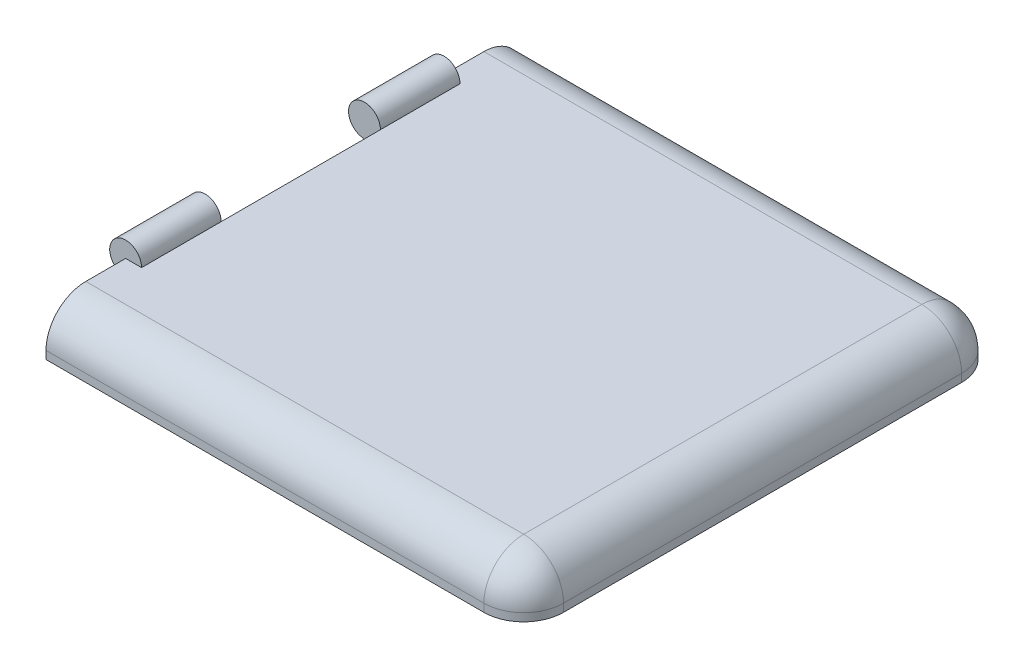
ISO-10303-21;
HEADER;
FILE_DESCRIPTION(('STEP AP214'),'2;1');
FILE_NAME('part.step','',(''),(''),'','','');
FILE_SCHEMA(('AUTOMOTIVE_DESIGN { 1 0 10303 214 1 1 1 1 }'));
ENDSEC;
DATA;
#1=APPLICATION_CONTEXT('core data for automotive mechanical design processes');
#2=APPLICATION_PROTOCOL_DEFINITION('international standard','automotive_design',2000,#1);
#3=PRODUCT_CONTEXT('',#1,'mechanical');
#4=PRODUCT('Part','Part','',(#3));
#5=PRODUCT_RELATED_PRODUCT_CATEGORY('part','',(#4));
#6=PRODUCT_DEFINITION_FORMATION('','',#4);
#7=PRODUCT_DEFINITION_CONTEXT('part definition',#1,'design');
#8=PRODUCT_DEFINITION('design','',#6,#7);
#9=PRODUCT_DEFINITION_SHAPE('','',#8);
#10=(LENGTH_UNIT() NAMED_UNIT(*) SI_UNIT(.MILLI.,.METRE.));
#11=(NAMED_UNIT(*) PLANE_ANGLE_UNIT() SI_UNIT($,.RADIAN.));
#12=(NAMED_UNIT(*) SI_UNIT($,.STERADIAN.) SOLID_ANGLE_UNIT());
#13=UNCERTAINTY_MEASURE_WITH_UNIT(LENGTH_MEASURE(1.E-05),#10,'distance_accuracy_value','');
#14=(GEOMETRIC_REPRESENTATION_CONTEXT(3) GLOBAL_UNCERTAINTY_ASSIGNED_CONTEXT((#13)) GLOBAL_UNIT_ASSIGNED_CONTEXT((#10,
#11,#12)) REPRESENTATION_CONTEXT('',''));
#15=CARTESIAN_POINT('',(0.,0.,0.));
#16=DIRECTION('',(0.,0.,1.));
#17=DIRECTION('',(1.,0.,0.));
#18=AXIS2_PLACEMENT_3D('',#15,#16,#17);
#19=CARTESIAN_POINT('',(0.,60.,0.));
#20=DIRECTION('',(1.,0.,0.));
#21=DIRECTION('',(0.,0.,-1.));
#22=AXIS2_PLACEMENT_3D('',#19,#20,#21);
#23=PLANE('',#22);
#24=DIRECTION('',(0.,-1.,0.));
#25=VECTOR('',#24,1.);
#26=CARTESIAN_POINT('',(0.,60.,0.));
#27=LINE('',#26,#25);
#28=CARTESIAN_POINT('',(0.,9.99999999999999,0.));
#29=VERTEX_POINT('',#28);
#30=CARTESIAN_POINT('',(0.,0.,0.));
#31=VERTEX_POINT('',#30);
#32=EDGE_CURVE('E290',#29,#31,#27,.T.);
#33=ORIENTED_EDGE('',*,*,#32,.F.);
#34=CARTESIAN_POINT('',(0.,9.99999999999999,-50.));
#35=DIRECTION('',(1.,0.,0.));
#36=DIRECTION('',(0.,0.,-1.));
#37=AXIS2_PLACEMENT_3D('',#34,#35,#36);
#38=CIRCLE('',#37,50.);
#39=CARTESIAN_POINT('',(0.,60.,-50.));
#40=VERTEX_POINT('',#39);
#41=EDGE_CURVE('E199',#29,#40,#38,.F.);
#42=ORIENTED_EDGE('',*,*,#41,.T.);
#43=DIRECTION('',(0.,0.,1.));
#44=VECTOR('',#43,1.);
#45=CARTESIAN_POINT('',(0.,60.,0.));
#46=LINE('',#45,#44);
#47=CARTESIAN_POINT('',(0.,60.,-100.));
#48=VERTEX_POINT('',#47);
#49=EDGE_CURVE('E272',#48,#40,#46,.T.);
#50=ORIENTED_EDGE('',*,*,#49,.F.);
#51=DIRECTION('',(0.,-1.,0.));
#52=VECTOR('',#51,1.);
#53=CARTESIAN_POINT('',(0.,60.,-100.));
#54=LINE('',#53,#52);
#55=CARTESIAN_POINT('',(0.,40.,-100.));
#56=VERTEX_POINT('',#55);
#57=EDGE_CURVE('E257',#48,#56,#54,.T.);
#58=ORIENTED_EDGE('',*,*,#57,.T.);
#59=DIRECTION('',(0.,0.,-1.));
#60=VECTOR('',#59,1.);
#61=CARTESIAN_POINT('',(0.,40.,-100.));
#62=LINE('',#61,#60);
#63=CARTESIAN_POINT('',(0.,40.,-200.));
#64=VERTEX_POINT('',#63);
#65=EDGE_CURVE('E263',#64,#56,#62,.F.);
#66=ORIENTED_EDGE('',*,*,#65,.F.);
#67=DIRECTION('',(0.,0.,1.));
#68=VECTOR('',#67,1.);
#69=CARTESIAN_POINT('',(0.,40.,-456.568542494924));
#70=LINE('',#69,#68);
#71=CARTESIAN_POINT('',(0.,40.,-400.));
#72=VERTEX_POINT('',#71);
#73=EDGE_CURVE('E145',#64,#72,#70,.F.);
#74=ORIENTED_EDGE('',*,*,#73,.T.);
#75=DIRECTION('',(0.,0.,1.));
#76=VECTOR('',#75,1.);
#77=CARTESIAN_POINT('',(0.,40.,-500.));
#78=LINE('',#77,#76);
#79=CARTESIAN_POINT('',(0.,40.,-500.));
#80=VERTEX_POINT('',#79);
#81=EDGE_CURVE('E161',#72,#80,#78,.F.);
#82=ORIENTED_EDGE('',*,*,#81,.T.);
#83=DIRECTION('',(0.,-1.,0.));
#84=VECTOR('',#83,1.);
#85=CARTESIAN_POINT('',(0.,60.,-500.));
#86=LINE('',#85,#84);
#87=CARTESIAN_POINT('',(0.,60.,-500.));
#88=VERTEX_POINT('',#87);
#89=EDGE_CURVE('E246',#88,#80,#86,.T.);
#90=ORIENTED_EDGE('',*,*,#89,.F.);
#91=CARTESIAN_POINT('',(0.,60.,-550.));
#92=VERTEX_POINT('',#91);
#93=EDGE_CURVE('E268',#92,#88,#46,.T.);
#94=ORIENTED_EDGE('',*,*,#93,.F.);
#95=CARTESIAN_POINT('',(0.,9.99999999999999,-550.));
#96=DIRECTION('',(1.,0.,0.));
#97=DIRECTION('',(0.,0.,-1.));
#98=AXIS2_PLACEMENT_3D('',#95,#96,#97);
#99=CIRCLE('',#98,50.);
#100=CARTESIAN_POINT('',(0.,9.99999999999999,-600.));
#101=VERTEX_POINT('',#100);
#102=EDGE_CURVE('E196',#92,#101,#99,.F.);
#103=ORIENTED_EDGE('',*,*,#102,.T.);
#104=DIRECTION('',(0.,-1.,0.));
#105=VECTOR('',#104,1.);
#106=CARTESIAN_POINT('',(0.,60.,-600.));
#107=LINE('',#106,#105);
#108=CARTESIAN_POINT('',(0.,0.,-600.));
#109=VERTEX_POINT('',#108);
#110=EDGE_CURVE('E271',#101,#109,#107,.T.);
#111=ORIENTED_EDGE('',*,*,#110,.T.);
#112=DIRECTION('',(0.,0.,1.));
#113=VECTOR('',#112,1.);
#114=CARTESIAN_POINT('',(0.,0.,0.));
#115=LINE('',#114,#113);
#116=EDGE_CURVE('E267',#109,#31,#115,.T.);
#117=ORIENTED_EDGE('',*,*,#116,.T.);
#118=EDGE_LOOP('',(#33,#42,#50,#58,#66,#74,#82,#90,#94,#103,#111,#117));
#119=FACE_BOUND('',#118,.T.);
#120=ADVANCED_FACE('F39',(#119),#23,.F.);
#121=CARTESIAN_POINT('',(0.,60.,0.));
#122=DIRECTION('',(0.,-1.,0.));
#123=DIRECTION('',(0.,0.,-1.));
#124=AXIS2_PLACEMENT_3D('',#121,#122,#123);
#125=PLANE('',#124);
#126=ORIENTED_EDGE('',*,*,#49,.T.);
#127=DIRECTION('',(1.,0.,0.));
#128=VECTOR('',#127,1.);
#129=CARTESIAN_POINT('',(0.,60.,-50.));
#130=LINE('',#129,#128);
#131=CARTESIAN_POINT('',(550.,60.,-50.));
#132=VERTEX_POINT('',#131);
#133=EDGE_CURVE('E186',#40,#132,#130,.T.);
#134=ORIENTED_EDGE('',*,*,#133,.T.);
#135=DIRECTION('',(0.,0.,-1.));
#136=VECTOR('',#135,1.);
#137=CARTESIAN_POINT('',(550.,60.,0.));
#138=LINE('',#137,#136);
#139=CARTESIAN_POINT('',(550.,60.,-550.));
#140=VERTEX_POINT('',#139);
#141=EDGE_CURVE('E183',#132,#140,#138,.T.);
#142=ORIENTED_EDGE('',*,*,#141,.T.);
#143=DIRECTION('',(-1.,0.,0.));
#144=VECTOR('',#143,1.);
#145=CARTESIAN_POINT('',(0.,60.,-550.));
#146=LINE('',#145,#144);
#147=EDGE_CURVE('E175',#140,#92,#146,.T.);
#148=ORIENTED_EDGE('',*,*,#147,.T.);
#149=ORIENTED_EDGE('',*,*,#93,.T.);
#150=DIRECTION('',(-1.,0.,0.));
#151=VECTOR('',#150,1.);
#152=CARTESIAN_POINT('',(0.,60.,-500.));
#153=LINE('',#152,#151);
#154=CARTESIAN_POINT('',(20.,60.,-500.));
#155=VERTEX_POINT('',#154);
#156=EDGE_CURVE('E169',#155,#88,#153,.T.);
#157=ORIENTED_EDGE('',*,*,#156,.F.);
#158=DIRECTION('',(0.,0.,1.));
#159=VECTOR('',#158,1.);
#160=CARTESIAN_POINT('',(20.,60.,-500.));
#161=LINE('',#160,#159);
#162=CARTESIAN_POINT('',(20.,60.,-400.));
#163=VERTEX_POINT('',#162);
#164=EDGE_CURVE('E158',#155,#163,#161,.T.);
#165=ORIENTED_EDGE('',*,*,#164,.T.);
#166=DIRECTION('',(0.,0.,1.));
#167=VECTOR('',#166,1.);
#168=CARTESIAN_POINT('',(20.,60.,-456.568542494924));
#169=LINE('',#168,#167);
#170=CARTESIAN_POINT('',(20.,60.,-200.));
#171=VERTEX_POINT('',#170);
#172=EDGE_CURVE('E134',#163,#171,#169,.T.);
#173=ORIENTED_EDGE('',*,*,#172,.T.);
#174=DIRECTION('',(0.,0.,-1.));
#175=VECTOR('',#174,1.);
#176=CARTESIAN_POINT('',(20.,60.,-100.));
#177=LINE('',#176,#175);
#178=CARTESIAN_POINT('',(20.,60.,-100.));
#179=VERTEX_POINT('',#178);
#180=EDGE_CURVE('E177',#179,#171,#177,.T.);
#181=ORIENTED_EDGE('',*,*,#180,.F.);
#182=DIRECTION('',(-1.,0.,0.));
#183=VECTOR('',#182,1.);
#184=CARTESIAN_POINT('',(0.,60.,-100.));
#185=LINE('',#184,#183);
#186=EDGE_CURVE('E171',#179,#48,#185,.T.);
#187=ORIENTED_EDGE('',*,*,#186,.T.);
#188=EDGE_LOOP('',(#126,#134,#142,#148,#149,#157,#165,#173,#181,#187));
#189=FACE_BOUND('',#188,.T.);
#190=ADVANCED_FACE('F167',(#189),#125,.F.);
#191=CARTESIAN_POINT('',(0.,60.,0.));
#192=DIRECTION('',(0.,0.,-1.));
#193=DIRECTION('',(-1.,0.,0.));
#194=AXIS2_PLACEMENT_3D('',#191,#192,#193);
#195=PLANE('',#194);
#196=DIRECTION('',(0.,-1.,0.));
#197=VECTOR('',#196,1.);
#198=CARTESIAN_POINT('',(550.,60.,0.));
#199=LINE('',#198,#197);
#200=CARTESIAN_POINT('',(550.,0.,0.));
#201=VERTEX_POINT('',#200);
#202=CARTESIAN_POINT('',(550.,9.99999999999999,0.));
#203=VERTEX_POINT('',#202);
#204=EDGE_CURVE('E190',#201,#203,#199,.F.);
#205=ORIENTED_EDGE('',*,*,#204,.T.);
#206=DIRECTION('',(1.,0.,0.));
#207=VECTOR('',#206,1.);
#208=CARTESIAN_POINT('',(0.,9.99999999999999,0.));
#209=LINE('',#208,#207);
#210=EDGE_CURVE('E193',#203,#29,#209,.F.);
#211=ORIENTED_EDGE('',*,*,#210,.T.);
#212=ORIENTED_EDGE('',*,*,#32,.T.);
#213=DIRECTION('',(1.,0.,0.));
#214=VECTOR('',#213,1.);
#215=CARTESIAN_POINT('',(0.,0.,0.));
#216=LINE('',#215,#214);
#217=EDGE_CURVE('E276',#31,#201,#216,.T.);
#218=ORIENTED_EDGE('',*,*,#217,.T.);
#219=EDGE_LOOP('',(#205,#211,#212,#218));
#220=FACE_BOUND('',#219,.T.);
#221=ADVANCED_FACE('F342',(#220),#195,.F.);
#222=CARTESIAN_POINT('',(600.,60.,0.));
#223=DIRECTION('',(-1.,0.,0.));
#224=DIRECTION('',(0.,0.,1.));
#225=AXIS2_PLACEMENT_3D('',#222,#223,#224);
#226=PLANE('',#225);
#227=DIRECTION('',(0.,0.,-1.));
#228=VECTOR('',#227,1.);
#229=CARTESIAN_POINT('',(600.,0.,0.));
#230=LINE('',#229,#228);
#231=CARTESIAN_POINT('',(600.,0.,-50.));
#232=VERTEX_POINT('',#231);
#233=CARTESIAN_POINT('',(600.,0.,-550.));
#234=VERTEX_POINT('',#233);
#235=EDGE_CURVE('E280',#232,#234,#230,.T.);
#236=ORIENTED_EDGE('',*,*,#235,.T.);
#237=DIRECTION('',(0.,-1.,0.));
#238=VECTOR('',#237,1.);
#239=CARTESIAN_POINT('',(600.,60.,-550.));
#240=LINE('',#239,#238);
#241=CARTESIAN_POINT('',(600.,9.99999999999999,-550.));
#242=VERTEX_POINT('',#241);
#243=EDGE_CURVE('E208',#234,#242,#240,.F.);
#244=ORIENTED_EDGE('',*,*,#243,.T.);
#245=DIRECTION('',(0.,0.,-1.));
#246=VECTOR('',#245,1.);
#247=CARTESIAN_POINT('',(600.,9.99999999999999,0.));
#248=LINE('',#247,#246);
#249=CARTESIAN_POINT('',(600.,9.99999999999999,-50.));
#250=VERTEX_POINT('',#249);
#251=EDGE_CURVE('E205',#242,#250,#248,.F.);
#252=ORIENTED_EDGE('',*,*,#251,.T.);
#253=DIRECTION('',(0.,-1.,0.));
#254=VECTOR('',#253,1.);
#255=CARTESIAN_POINT('',(600.,60.,-50.));
#256=LINE('',#255,#254);
#257=EDGE_CURVE('E202',#250,#232,#256,.T.);
#258=ORIENTED_EDGE('',*,*,#257,.T.);
#259=EDGE_LOOP('',(#236,#244,#252,#258));
#260=FACE_BOUND('',#259,.T.);
#261=ADVANCED_FACE('F333',(#260),#226,.F.);
#262=CARTESIAN_POINT('',(0.,60.,-600.));
#263=DIRECTION('',(0.,0.,1.));
#264=DIRECTION('',(1.,0.,0.));
#265=AXIS2_PLACEMENT_3D('',#262,#263,#264);
#266=PLANE('',#265);
#267=ORIENTED_EDGE('',*,*,#110,.F.);
#268=DIRECTION('',(-1.,0.,0.));
#269=VECTOR('',#268,1.);
#270=CARTESIAN_POINT('',(0.,9.99999999999999,-600.));
#271=LINE('',#270,#269);
#272=CARTESIAN_POINT('',(550.,9.99999999999999,-600.));
#273=VERTEX_POINT('',#272);
#274=EDGE_CURVE('E57',#101,#273,#271,.F.);
#275=ORIENTED_EDGE('',*,*,#274,.T.);
#276=DIRECTION('',(0.,-1.,0.));
#277=VECTOR('',#276,1.);
#278=CARTESIAN_POINT('',(550.,60.,-600.));
#279=LINE('',#278,#277);
#280=CARTESIAN_POINT('',(550.,0.,-600.));
#281=VERTEX_POINT('',#280);
#282=EDGE_CURVE('E61',#273,#281,#279,.T.);
#283=ORIENTED_EDGE('',*,*,#282,.T.);
#284=DIRECTION('',(-1.,0.,0.));
#285=VECTOR('',#284,1.);
#286=CARTESIAN_POINT('',(0.,0.,-600.));
#287=LINE('',#286,#285);
#288=EDGE_CURVE('E284',#281,#109,#287,.T.);
#289=ORIENTED_EDGE('',*,*,#288,.T.);
#290=EDGE_LOOP('',(#267,#275,#283,#289));
#291=FACE_BOUND('',#290,.T.);
#292=ADVANCED_FACE('F323',(#291),#266,.F.);
#293=CARTESIAN_POINT('',(0.,0.,0.));
#294=DIRECTION('',(0.,-1.,0.));
#295=DIRECTION('',(0.,0.,-1.));
#296=AXIS2_PLACEMENT_3D('',#293,#294,#295);
#297=PLANE('',#296);
#298=ORIENTED_EDGE('',*,*,#288,.F.);
#299=CARTESIAN_POINT('',(550.,0.,-550.));
#300=DIRECTION('',(0.,-1.,0.));
#301=DIRECTION('',(0.,0.,-1.));
#302=AXIS2_PLACEMENT_3D('',#299,#300,#301);
#303=CIRCLE('',#302,50.);
#304=EDGE_CURVE('E11',#281,#234,#303,.T.);
#305=ORIENTED_EDGE('',*,*,#304,.T.);
#306=ORIENTED_EDGE('',*,*,#235,.F.);
#307=CARTESIAN_POINT('',(550.,0.,-50.));
#308=DIRECTION('',(0.,-1.,0.));
#309=DIRECTION('',(0.,0.,-1.));
#310=AXIS2_PLACEMENT_3D('',#307,#308,#309);
#311=CIRCLE('',#310,50.);
#312=EDGE_CURVE('E49',#232,#201,#311,.T.);
#313=ORIENTED_EDGE('',*,*,#312,.T.);
#314=ORIENTED_EDGE('',*,*,#217,.F.);
#315=ORIENTED_EDGE('',*,*,#116,.F.);
#316=EDGE_LOOP('',(#298,#305,#306,#313,#314,#315));
#317=FACE_BOUND('',#316,.T.);
#318=ADVANCED_FACE('F326',(#317),#297,.T.);
#319=CARTESIAN_POINT('',(0.,60.,-100.));
#320=DIRECTION('',(0.,0.,-1.));
#321=DIRECTION('',(-1.,0.,0.));
#322=AXIS2_PLACEMENT_3D('',#319,#320,#321);
#323=CYLINDRICAL_SURFACE('',#322,20.);
#324=CARTESIAN_POINT('',(0.,60.,-200.));
#325=DIRECTION('',(0.,0.,1.));
#326=DIRECTION('',(1.,0.,0.));
#327=AXIS2_PLACEMENT_3D('',#324,#325,#326);
#328=CIRCLE('',#327,20.);
#329=EDGE_CURVE('E252',#171,#64,#328,.T.);
#330=ORIENTED_EDGE('',*,*,#329,.T.);
#331=ORIENTED_EDGE('',*,*,#65,.T.);
#332=CARTESIAN_POINT('',(0.,60.,-100.));
#333=DIRECTION('',(0.,0.,1.));
#334=DIRECTION('',(1.,0.,0.));
#335=AXIS2_PLACEMENT_3D('',#332,#333,#334);
#336=CIRCLE('',#335,20.);
#337=EDGE_CURVE('E253',#179,#56,#336,.T.);
#338=ORIENTED_EDGE('',*,*,#337,.F.);
#339=ORIENTED_EDGE('',*,*,#180,.T.);
#340=EDGE_LOOP('',(#330,#331,#338,#339));
#341=FACE_BOUND('',#340,.T.);
#342=ADVANCED_FACE('F296',(#341),#323,.T.);
#343=CARTESIAN_POINT('',(0.,60.,-100.));
#344=DIRECTION('',(0.,0.,1.));
#345=DIRECTION('',(1.,0.,0.));
#346=AXIS2_PLACEMENT_3D('',#343,#344,#345);
#347=PLANE('',#346);
#348=ORIENTED_EDGE('',*,*,#57,.F.);
#349=ORIENTED_EDGE('',*,*,#186,.F.);
#350=ORIENTED_EDGE('',*,*,#337,.T.);
#351=EDGE_LOOP('',(#348,#349,#350));
#352=FACE_BOUND('',#351,.T.);
#353=ADVANCED_FACE('F306',(#352),#347,.T.);
#354=CARTESIAN_POINT('',(0.,60.,-200.));
#355=DIRECTION('',(0.,0.,1.));
#356=DIRECTION('',(1.,0.,0.));
#357=AXIS2_PLACEMENT_3D('',#354,#355,#356);
#358=PLANE('',#357);
#359=CARTESIAN_POINT('',(0.,60.,-200.));
#360=DIRECTION('',(0.,0.,1.));
#361=DIRECTION('',(1.,0.,0.));
#362=AXIS2_PLACEMENT_3D('',#359,#360,#361);
#363=CIRCLE('',#362,20.);
#364=EDGE_CURVE('E140',#64,#171,#363,.T.);
#365=ORIENTED_EDGE('',*,*,#364,.F.);
#366=ORIENTED_EDGE('',*,*,#329,.F.);
#367=EDGE_LOOP('',(#365,#366));
#368=FACE_BOUND('',#367,.T.);
#369=ADVANCED_FACE('F299',(#368),#358,.F.);
#370=CARTESIAN_POINT('',(0.,60.,-500.));
#371=DIRECTION('',(0.,0.,1.));
#372=DIRECTION('',(1.,0.,0.));
#373=AXIS2_PLACEMENT_3D('',#370,#371,#372);
#374=CYLINDRICAL_SURFACE('',#373,20.);
#375=ORIENTED_EDGE('',*,*,#81,.F.);
#376=CARTESIAN_POINT('',(0.,60.,-400.));
#377=DIRECTION('',(0.,0.,1.));
#378=DIRECTION('',(1.,0.,0.));
#379=AXIS2_PLACEMENT_3D('',#376,#377,#378);
#380=CIRCLE('',#379,20.);
#381=EDGE_CURVE('E151',#163,#72,#380,.T.);
#382=ORIENTED_EDGE('',*,*,#381,.F.);
#383=ORIENTED_EDGE('',*,*,#164,.F.);
#384=CARTESIAN_POINT('',(0.,60.,-500.));
#385=DIRECTION('',(0.,0.,1.));
#386=DIRECTION('',(1.,0.,0.));
#387=AXIS2_PLACEMENT_3D('',#384,#385,#386);
#388=CIRCLE('',#387,20.);
#389=EDGE_CURVE('E163',#155,#80,#388,.T.);
#390=ORIENTED_EDGE('',*,*,#389,.T.);
#391=EDGE_LOOP('',(#375,#382,#383,#390));
#392=FACE_BOUND('',#391,.T.);
#393=ADVANCED_FACE('F156',(#392),#374,.T.);
#394=CARTESIAN_POINT('',(0.,60.,-500.));
#395=DIRECTION('',(0.,0.,1.));
#396=DIRECTION('',(1.,0.,0.));
#397=AXIS2_PLACEMENT_3D('',#394,#395,#396);
#398=PLANE('',#397);
#399=ORIENTED_EDGE('',*,*,#156,.T.);
#400=ORIENTED_EDGE('',*,*,#89,.T.);
#401=ORIENTED_EDGE('',*,*,#389,.F.);
#402=EDGE_LOOP('',(#399,#400,#401));
#403=FACE_BOUND('',#402,.T.);
#404=ADVANCED_FACE('F380',(#403),#398,.F.);
#405=CARTESIAN_POINT('',(0.,60.,-400.));
#406=DIRECTION('',(0.,0.,1.));
#407=DIRECTION('',(1.,0.,0.));
#408=AXIS2_PLACEMENT_3D('',#405,#406,#407);
#409=PLANE('',#408);
#410=ORIENTED_EDGE('',*,*,#381,.T.);
#411=CARTESIAN_POINT('',(0.,60.,-400.));
#412=DIRECTION('',(0.,0.,1.));
#413=DIRECTION('',(1.,0.,0.));
#414=AXIS2_PLACEMENT_3D('',#411,#412,#413);
#415=CIRCLE('',#414,20.);
#416=EDGE_CURVE('E137',#163,#72,#415,.F.);
#417=ORIENTED_EDGE('',*,*,#416,.F.);
#418=EDGE_LOOP('',(#410,#417));
#419=FACE_BOUND('',#418,.T.);
#420=ADVANCED_FACE('F150',(#419),#409,.T.);
#421=CARTESIAN_POINT('',(0.,60.,-456.568542494924));
#422=DIRECTION('',(0.,0.,1.));
#423=DIRECTION('',(1.,0.,0.));
#424=AXIS2_PLACEMENT_3D('',#421,#422,#423);
#425=CYLINDRICAL_SURFACE('',#424,20.);
#426=ORIENTED_EDGE('',*,*,#364,.T.);
#427=ORIENTED_EDGE('',*,*,#172,.F.);
#428=ORIENTED_EDGE('',*,*,#416,.T.);
#429=ORIENTED_EDGE('',*,*,#73,.F.);
#430=EDGE_LOOP('',(#426,#427,#428,#429));
#431=FACE_BOUND('',#430,.T.);
#432=ADVANCED_FACE('F136',(#431),#425,.F.);
#433=CARTESIAN_POINT('',(0.,9.99999999999999,-550.));
#434=DIRECTION('',(-1.,0.,0.));
#435=DIRECTION('',(0.,0.,1.));
#436=AXIS2_PLACEMENT_3D('',#433,#434,#435);
#437=CYLINDRICAL_SURFACE('',#436,50.);
#438=ORIENTED_EDGE('',*,*,#102,.F.);
#439=ORIENTED_EDGE('',*,*,#147,.F.);
#440=CARTESIAN_POINT('',(550.,9.99999999999999,-550.));
#441=DIRECTION('',(1.,0.,0.));
#442=DIRECTION('',(0.,0.,-1.));
#443=AXIS2_PLACEMENT_3D('',#440,#441,#442);
#444=CIRCLE('',#443,50.);
#445=EDGE_CURVE('E43',#273,#140,#444,.T.);
#446=ORIENTED_EDGE('',*,*,#445,.F.);
#447=ORIENTED_EDGE('',*,*,#274,.F.);
#448=EDGE_LOOP('',(#438,#439,#446,#447));
#449=FACE_BOUND('',#448,.T.);
#450=ADVANCED_FACE('F41',(#449),#437,.T.);
#451=CARTESIAN_POINT('',(550.,60.,-550.));
#452=DIRECTION('',(0.,-1.,0.));
#453=DIRECTION('',(0.,0.,-1.));
#454=AXIS2_PLACEMENT_3D('',#451,#452,#453);
#455=CYLINDRICAL_SURFACE('',#454,50.);
#456=ORIENTED_EDGE('',*,*,#304,.F.);
#457=ORIENTED_EDGE('',*,*,#282,.F.);
#458=CARTESIAN_POINT('',(550.,9.99999999999999,-550.));
#459=DIRECTION('',(0.,1.,0.));
#460=DIRECTION('',(0.,0.,1.));
#461=AXIS2_PLACEMENT_3D('',#458,#459,#460);
#462=CIRCLE('',#461,50.);
#463=EDGE_CURVE('E231',#242,#273,#462,.T.);
#464=ORIENTED_EDGE('',*,*,#463,.F.);
#465=ORIENTED_EDGE('',*,*,#243,.F.);
#466=EDGE_LOOP('',(#456,#457,#464,#465));
#467=FACE_BOUND('',#466,.T.);
#468=ADVANCED_FACE('F331',(#467),#455,.T.);
#469=CARTESIAN_POINT('',(550.,9.99999999999999,-550.));
#470=DIRECTION('',(0.,0.,-1.));
#471=DIRECTION('',(-1.,0.,0.));
#472=AXIS2_PLACEMENT_3D('',#469,#470,#471);
#473=SPHERICAL_SURFACE('',#472,50.);
#474=ORIENTED_EDGE('',*,*,#463,.T.);
#475=ORIENTED_EDGE('',*,*,#445,.T.);
#476=CARTESIAN_POINT('',(550.,9.99999999999999,-550.));
#477=DIRECTION('',(0.,0.,-1.));
#478=DIRECTION('',(-1.,0.,0.));
#479=AXIS2_PLACEMENT_3D('',#476,#477,#478);
#480=CIRCLE('',#479,50.);
#481=EDGE_CURVE('E228',#242,#140,#480,.F.);
#482=ORIENTED_EDGE('',*,*,#481,.F.);
#483=EDGE_LOOP('',(#474,#475,#482));
#484=FACE_BOUND('',#483,.T.);
#485=ADVANCED_FACE('F367',(#484),#473,.T.);
#486=CARTESIAN_POINT('',(550.,9.99999999999999,0.));
#487=DIRECTION('',(0.,0.,-1.));
#488=DIRECTION('',(-1.,0.,0.));
#489=AXIS2_PLACEMENT_3D('',#486,#487,#488);
#490=CYLINDRICAL_SURFACE('',#489,50.);
#491=ORIENTED_EDGE('',*,*,#481,.T.);
#492=ORIENTED_EDGE('',*,*,#141,.F.);
#493=CARTESIAN_POINT('',(550.,9.99999999999999,-50.));
#494=DIRECTION('',(0.,0.,1.));
#495=DIRECTION('',(1.,0.,0.));
#496=AXIS2_PLACEMENT_3D('',#493,#494,#495);
#497=CIRCLE('',#496,50.);
#498=EDGE_CURVE('E224',#250,#132,#497,.T.);
#499=ORIENTED_EDGE('',*,*,#498,.F.);
#500=ORIENTED_EDGE('',*,*,#251,.F.);
#501=EDGE_LOOP('',(#491,#492,#499,#500));
#502=FACE_BOUND('',#501,.T.);
#503=ADVANCED_FACE('F364',(#502),#490,.T.);
#504=CARTESIAN_POINT('',(550.,60.,-50.));
#505=DIRECTION('',(0.,-1.,0.));
#506=DIRECTION('',(0.,0.,-1.));
#507=AXIS2_PLACEMENT_3D('',#504,#505,#506);
#508=CYLINDRICAL_SURFACE('',#507,50.);
#509=ORIENTED_EDGE('',*,*,#312,.F.);
#510=ORIENTED_EDGE('',*,*,#257,.F.);
#511=CARTESIAN_POINT('',(550.,9.99999999999999,-50.));
#512=DIRECTION('',(0.,1.,0.));
#513=DIRECTION('',(0.,0.,1.));
#514=AXIS2_PLACEMENT_3D('',#511,#512,#513);
#515=CIRCLE('',#514,50.);
#516=EDGE_CURVE('E220',#203,#250,#515,.T.);
#517=ORIENTED_EDGE('',*,*,#516,.F.);
#518=ORIENTED_EDGE('',*,*,#204,.F.);
#519=EDGE_LOOP('',(#509,#510,#517,#518));
#520=FACE_BOUND('',#519,.T.);
#521=ADVANCED_FACE('F339',(#520),#508,.T.);
#522=CARTESIAN_POINT('',(550.,9.99999999999999,-50.));
#523=DIRECTION('',(1.,0.,0.));
#524=DIRECTION('',(0.,0.,-1.));
#525=AXIS2_PLACEMENT_3D('',#522,#523,#524);
#526=SPHERICAL_SURFACE('',#525,50.);
#527=ORIENTED_EDGE('',*,*,#516,.T.);
#528=ORIENTED_EDGE('',*,*,#498,.T.);
#529=CARTESIAN_POINT('',(550.,9.99999999999999,-50.));
#530=DIRECTION('',(1.,0.,0.));
#531=DIRECTION('',(0.,0.,-1.));
#532=AXIS2_PLACEMENT_3D('',#529,#530,#531);
#533=CIRCLE('',#532,50.);
#534=EDGE_CURVE('E217',#203,#132,#533,.F.);
#535=ORIENTED_EDGE('',*,*,#534,.F.);
#536=EDGE_LOOP('',(#527,#528,#535));
#537=FACE_BOUND('',#536,.T.);
#538=ADVANCED_FACE('F358',(#537),#526,.T.);
#539=CARTESIAN_POINT('',(0.,9.99999999999999,-50.));
#540=DIRECTION('',(1.,0.,0.));
#541=DIRECTION('',(0.,0.,-1.));
#542=AXIS2_PLACEMENT_3D('',#539,#540,#541);
#543=CYLINDRICAL_SURFACE('',#542,50.);
#544=ORIENTED_EDGE('',*,*,#41,.F.);
#545=ORIENTED_EDGE('',*,*,#210,.F.);
#546=ORIENTED_EDGE('',*,*,#534,.T.);
#547=ORIENTED_EDGE('',*,*,#133,.F.);
#548=EDGE_LOOP('',(#544,#545,#546,#547));
#549=FACE_BOUND('',#548,.T.);
#550=ADVANCED_FACE('F312',(#549),#543,.T.);
#551=CLOSED_SHELL('',(#120,#190,#221,#261,#292,#318,#342,#353,#369,#393,#404,#420,#432,#450,
#468,#485,#503,#521,#538,#550));
#552=MANIFOLD_SOLID_BREP('B2',#551);
#553=ADVANCED_BREP_SHAPE_REPRESENTATION('',(#18,#552),#14);
#554=SHAPE_DEFINITION_REPRESENTATION(#9,#553);
ENDSEC;
END-ISO-10303-21;
